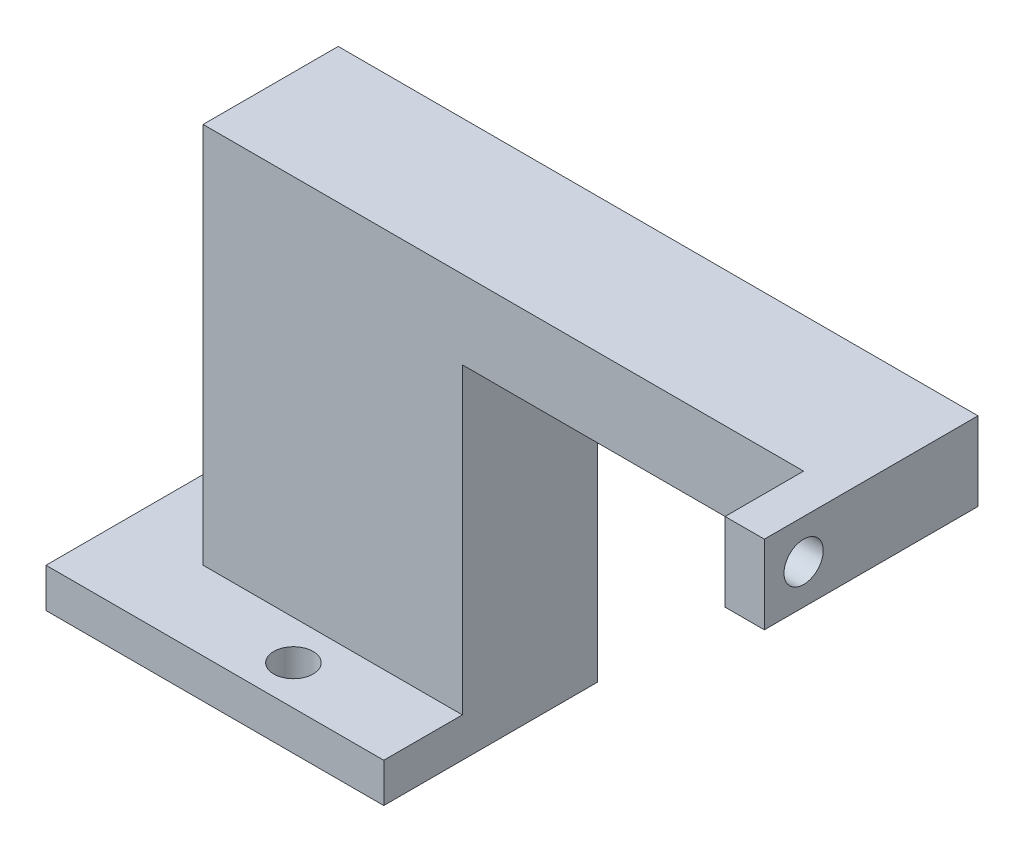
ISO-10303-21;
HEADER;
FILE_DESCRIPTION(('STEP AP214'),'2;1');
FILE_NAME('part.step','',(''),(''),'','','');
FILE_SCHEMA(('AUTOMOTIVE_DESIGN { 1 0 10303 214 1 1 1 1 }'));
ENDSEC;
DATA;
#1=APPLICATION_CONTEXT('core data for automotive mechanical design processes');
#2=APPLICATION_PROTOCOL_DEFINITION('international standard','automotive_design',2000,#1);
#3=PRODUCT_CONTEXT('',#1,'mechanical');
#4=PRODUCT('Part','Part','',(#3));
#5=PRODUCT_RELATED_PRODUCT_CATEGORY('part','',(#4));
#6=PRODUCT_DEFINITION_FORMATION('','',#4);
#7=PRODUCT_DEFINITION_CONTEXT('part definition',#1,'design');
#8=PRODUCT_DEFINITION('design','',#6,#7);
#9=PRODUCT_DEFINITION_SHAPE('','',#8);
#10=(LENGTH_UNIT() NAMED_UNIT(*) SI_UNIT(.MILLI.,.METRE.));
#11=(NAMED_UNIT(*) PLANE_ANGLE_UNIT() SI_UNIT($,.RADIAN.));
#12=(NAMED_UNIT(*) SI_UNIT($,.STERADIAN.) SOLID_ANGLE_UNIT());
#13=UNCERTAINTY_MEASURE_WITH_UNIT(LENGTH_MEASURE(1.E-05),#10,'distance_accuracy_value','');
#14=(GEOMETRIC_REPRESENTATION_CONTEXT(3) GLOBAL_UNCERTAINTY_ASSIGNED_CONTEXT((#13)) GLOBAL_UNIT_ASSIGNED_CONTEXT((#10,
#11,#12)) REPRESENTATION_CONTEXT('',''));
#15=CARTESIAN_POINT('',(0.,0.,0.));
#16=DIRECTION('',(0.,0.,1.));
#17=DIRECTION('',(1.,0.,0.));
#18=AXIS2_PLACEMENT_3D('',#15,#16,#17);
#19=CARTESIAN_POINT('',(-22.77,53.6,-7.8375));
#20=DIRECTION('',(1.,0.,0.));
#21=DIRECTION('',(0.,0.,-1.));
#22=AXIS2_PLACEMENT_3D('',#19,#20,#21);
#23=PLANE('',#22);
#24=DIRECTION('',(0.,0.,-1.));
#25=VECTOR('',#24,1.);
#26=CARTESIAN_POINT('',(-22.77,5.,19.3625));
#27=LINE('',#26,#25);
#28=CARTESIAN_POINT('',(-22.77,5.,9.3625));
#29=VERTEX_POINT('',#28);
#30=CARTESIAN_POINT('',(-22.77,5.,-7.8375));
#31=VERTEX_POINT('',#30);
#32=EDGE_CURVE('E11',#29,#31,#27,.T.);
#33=ORIENTED_EDGE('',*,*,#32,.F.);
#34=DIRECTION('',(0.,-1.,0.));
#35=VECTOR('',#34,1.);
#36=CARTESIAN_POINT('',(-22.77,53.6,9.3625));
#37=LINE('',#36,#35);
#38=CARTESIAN_POINT('',(-22.77,53.6,9.3625));
#39=VERTEX_POINT('',#38);
#40=EDGE_CURVE('E42',#39,#29,#37,.T.);
#41=ORIENTED_EDGE('',*,*,#40,.F.);
#42=DIRECTION('',(0.,0.,1.));
#43=VECTOR('',#42,1.);
#44=CARTESIAN_POINT('',(-22.77,53.6,-7.8375));
#45=LINE('',#44,#43);
#46=CARTESIAN_POINT('',(-22.77,53.6,-7.8375));
#47=VERTEX_POINT('',#46);
#48=EDGE_CURVE('E223',#47,#39,#45,.T.);
#49=ORIENTED_EDGE('',*,*,#48,.F.);
#50=DIRECTION('',(0.,-1.,0.));
#51=VECTOR('',#50,1.);
#52=CARTESIAN_POINT('',(-22.77,53.6,-7.8375));
#53=LINE('',#52,#51);
#54=EDGE_CURVE('E235',#47,#31,#53,.T.);
#55=ORIENTED_EDGE('',*,*,#54,.T.);
#56=EDGE_LOOP('',(#33,#41,#49,#55));
#57=FACE_BOUND('',#56,.T.);
#58=ADVANCED_FACE('F39',(#57),#23,.F.);
#59=CARTESIAN_POINT('',(-22.77,53.6,9.3625));
#60=DIRECTION('',(0.,0.,-1.));
#61=DIRECTION('',(-1.,0.,0.));
#62=AXIS2_PLACEMENT_3D('',#59,#60,#61);
#63=PLANE('',#62);
#64=DIRECTION('',(0.,-1.,0.));
#65=VECTOR('',#64,1.);
#66=CARTESIAN_POINT('',(53.68,53.6,9.3625));
#67=LINE('',#66,#65);
#68=CARTESIAN_POINT('',(53.68,53.6,9.3625));
#69=VERTEX_POINT('',#68);
#70=CARTESIAN_POINT('',(53.68,43.6,9.3625));
#71=VERTEX_POINT('',#70);
#72=EDGE_CURVE('E171',#69,#71,#67,.T.);
#73=ORIENTED_EDGE('',*,*,#72,.F.);
#74=DIRECTION('',(1.,0.,0.));
#75=VECTOR('',#74,1.);
#76=CARTESIAN_POINT('',(-22.77,53.6,9.3625));
#77=LINE('',#76,#75);
#78=EDGE_CURVE('E227',#39,#69,#77,.T.);
#79=ORIENTED_EDGE('',*,*,#78,.F.);
#80=ORIENTED_EDGE('',*,*,#40,.T.);
#81=DIRECTION('',(-1.,0.,0.));
#82=VECTOR('',#81,1.);
#83=CARTESIAN_POINT('',(-22.77,5.,9.3625));
#84=LINE('',#83,#82);
#85=CARTESIAN_POINT('',(10.23,5.,9.3625));
#86=VERTEX_POINT('',#85);
#87=EDGE_CURVE('E55',#86,#29,#84,.T.);
#88=ORIENTED_EDGE('',*,*,#87,.F.);
#89=DIRECTION('',(0.,-1.,0.));
#90=VECTOR('',#89,1.);
#91=CARTESIAN_POINT('',(10.23,53.6,9.3625));
#92=LINE('',#91,#90);
#93=CARTESIAN_POINT('',(10.23,43.6,9.3625));
#94=VERTEX_POINT('',#93);
#95=EDGE_CURVE('E245',#94,#86,#92,.T.);
#96=ORIENTED_EDGE('',*,*,#95,.F.);
#97=DIRECTION('',(-1.,0.,0.));
#98=VECTOR('',#97,1.);
#99=CARTESIAN_POINT('',(58.68,43.6,9.36249999999999));
#100=LINE('',#99,#98);
#101=EDGE_CURVE('E63',#71,#94,#100,.T.);
#102=ORIENTED_EDGE('',*,*,#101,.F.);
#103=EDGE_LOOP('',(#73,#79,#80,#88,#96,#102));
#104=FACE_BOUND('',#103,.T.);
#105=ADVANCED_FACE('F251',(#104),#63,.F.);
#106=CARTESIAN_POINT('',(10.23,53.6,-7.8375));
#107=DIRECTION('',(-1.,0.,0.));
#108=DIRECTION('',(0.,0.,1.));
#109=AXIS2_PLACEMENT_3D('',#106,#107,#108);
#110=PLANE('',#109);
#111=DIRECTION('',(0.,0.,-1.));
#112=VECTOR('',#111,1.);
#113=CARTESIAN_POINT('',(10.23,43.6,9.3625));
#114=LINE('',#113,#112);
#115=CARTESIAN_POINT('',(10.23,43.6,-7.8375));
#116=VERTEX_POINT('',#115);
#117=EDGE_CURVE('E203',#94,#116,#114,.T.);
#118=ORIENTED_EDGE('',*,*,#117,.F.);
#119=ORIENTED_EDGE('',*,*,#95,.T.);
#120=DIRECTION('',(0.,0.,-1.));
#121=VECTOR('',#120,1.);
#122=CARTESIAN_POINT('',(10.23,5.,19.3625));
#123=LINE('',#122,#121);
#124=CARTESIAN_POINT('',(10.23,5.,19.3625));
#125=VERTEX_POINT('',#124);
#126=EDGE_CURVE('E139',#125,#86,#123,.T.);
#127=ORIENTED_EDGE('',*,*,#126,.F.);
#128=DIRECTION('',(0.,1.,0.));
#129=VECTOR('',#128,1.);
#130=CARTESIAN_POINT('',(10.23,0.,19.3625));
#131=LINE('',#130,#129);
#132=CARTESIAN_POINT('',(10.23,0.,19.3625));
#133=VERTEX_POINT('',#132);
#134=EDGE_CURVE('E134',#133,#125,#131,.T.);
#135=ORIENTED_EDGE('',*,*,#134,.F.);
#136=DIRECTION('',(0.,0.,-1.));
#137=VECTOR('',#136,1.);
#138=CARTESIAN_POINT('',(10.23,0.,-7.8375));
#139=LINE('',#138,#137);
#140=CARTESIAN_POINT('',(10.23,0.,-7.8375));
#141=VERTEX_POINT('',#140);
#142=EDGE_CURVE('E222',#133,#141,#139,.T.);
#143=ORIENTED_EDGE('',*,*,#142,.T.);
#144=DIRECTION('',(0.,-1.,0.));
#145=VECTOR('',#144,1.);
#146=CARTESIAN_POINT('',(10.23,53.6,-7.8375));
#147=LINE('',#146,#145);
#148=EDGE_CURVE('E243',#116,#141,#147,.T.);
#149=ORIENTED_EDGE('',*,*,#148,.F.);
#150=EDGE_LOOP('',(#118,#119,#127,#135,#143,#149));
#151=FACE_BOUND('',#150,.T.);
#152=ADVANCED_FACE('F254',(#151),#110,.F.);
#153=CARTESIAN_POINT('',(-22.77,53.6,-7.8375));
#154=DIRECTION('',(0.,0.,1.));
#155=DIRECTION('',(1.,0.,0.));
#156=AXIS2_PLACEMENT_3D('',#153,#154,#155);
#157=PLANE('',#156);
#158=DIRECTION('',(-1.,0.,0.));
#159=VECTOR('',#158,1.);
#160=CARTESIAN_POINT('',(-22.77,0.,-7.8375));
#161=LINE('',#160,#159);
#162=CARTESIAN_POINT('',(-32.77,0.,-7.8375));
#163=VERTEX_POINT('',#162);
#164=EDGE_CURVE('E228',#141,#163,#161,.T.);
#165=ORIENTED_EDGE('',*,*,#164,.T.);
#166=DIRECTION('',(0.,-1.,0.));
#167=VECTOR('',#166,1.);
#168=CARTESIAN_POINT('',(-32.77,5.,-7.8375));
#169=LINE('',#168,#167);
#170=CARTESIAN_POINT('',(-32.77,5.,-7.8375));
#171=VERTEX_POINT('',#170);
#172=EDGE_CURVE('E150',#171,#163,#169,.T.);
#173=ORIENTED_EDGE('',*,*,#172,.F.);
#174=DIRECTION('',(1.,0.,0.));
#175=VECTOR('',#174,1.);
#176=CARTESIAN_POINT('',(-32.77,5.,-7.8375));
#177=LINE('',#176,#175);
#178=EDGE_CURVE('E145',#171,#31,#177,.T.);
#179=ORIENTED_EDGE('',*,*,#178,.T.);
#180=ORIENTED_EDGE('',*,*,#54,.F.);
#181=DIRECTION('',(-1.,0.,0.));
#182=VECTOR('',#181,1.);
#183=CARTESIAN_POINT('',(-22.77,53.6,-7.8375));
#184=LINE('',#183,#182);
#185=CARTESIAN_POINT('',(58.68,53.6,-7.83750000000001));
#186=VERTEX_POINT('',#185);
#187=EDGE_CURVE('E232',#186,#47,#184,.T.);
#188=ORIENTED_EDGE('',*,*,#187,.F.);
#189=DIRECTION('',(0.,1.,0.));
#190=VECTOR('',#189,1.);
#191=CARTESIAN_POINT('',(58.68,53.6,-7.83750000000001));
#192=LINE('',#191,#190);
#193=CARTESIAN_POINT('',(58.68,43.6,-7.83750000000001));
#194=VERTEX_POINT('',#193);
#195=EDGE_CURVE('E207',#194,#186,#192,.T.);
#196=ORIENTED_EDGE('',*,*,#195,.F.);
#197=DIRECTION('',(-1.,0.,0.));
#198=VECTOR('',#197,1.);
#199=CARTESIAN_POINT('',(58.68,43.6,-7.83750000000001));
#200=LINE('',#199,#198);
#201=EDGE_CURVE('E214',#194,#116,#200,.T.);
#202=ORIENTED_EDGE('',*,*,#201,.T.);
#203=ORIENTED_EDGE('',*,*,#148,.T.);
#204=EDGE_LOOP('',(#165,#173,#179,#180,#188,#196,#202,#203));
#205=FACE_BOUND('',#204,.T.);
#206=ADVANCED_FACE('F259',(#205),#157,.F.);
#207=CARTESIAN_POINT('',(0.,53.6,0.));
#208=DIRECTION('',(0.,1.,0.));
#209=DIRECTION('',(0.,0.,1.));
#210=AXIS2_PLACEMENT_3D('',#207,#208,#209);
#211=PLANE('',#210);
#212=ORIENTED_EDGE('',*,*,#48,.T.);
#213=ORIENTED_EDGE('',*,*,#78,.T.);
#214=DIRECTION('',(0.,0.,-1.));
#215=VECTOR('',#214,1.);
#216=CARTESIAN_POINT('',(53.68,53.6,19.3625));
#217=LINE('',#216,#215);
#218=CARTESIAN_POINT('',(53.68,53.6,19.3625));
#219=VERTEX_POINT('',#218);
#220=EDGE_CURVE('E191',#219,#69,#217,.T.);
#221=ORIENTED_EDGE('',*,*,#220,.F.);
#222=DIRECTION('',(-1.,0.,0.));
#223=VECTOR('',#222,1.);
#224=CARTESIAN_POINT('',(58.68,53.6,19.3625));
#225=LINE('',#224,#223);
#226=CARTESIAN_POINT('',(58.68,53.6,19.3625));
#227=VERTEX_POINT('',#226);
#228=EDGE_CURVE('E176',#227,#219,#225,.T.);
#229=ORIENTED_EDGE('',*,*,#228,.F.);
#230=DIRECTION('',(0.,0.,1.));
#231=VECTOR('',#230,1.);
#232=CARTESIAN_POINT('',(58.68,53.6,9.36249999999999));
#233=LINE('',#232,#231);
#234=EDGE_CURVE('E211',#186,#227,#233,.T.);
#235=ORIENTED_EDGE('',*,*,#234,.F.);
#236=ORIENTED_EDGE('',*,*,#187,.T.);
#237=EDGE_LOOP('',(#212,#213,#221,#229,#235,#236));
#238=FACE_BOUND('',#237,.T.);
#239=ADVANCED_FACE('F268',(#238),#211,.T.);
#240=CARTESIAN_POINT('',(0.,0.,0.));
#241=DIRECTION('',(0.,1.,0.));
#242=DIRECTION('',(0.,0.,1.));
#243=AXIS2_PLACEMENT_3D('',#240,#241,#242);
#244=PLANE('',#243);
#245=CARTESIAN_POINT('',(-27.77,0.,0.));
#246=DIRECTION('',(0.,1.,0.));
#247=DIRECTION('',(0.,0.,1.));
#248=AXIS2_PLACEMENT_3D('',#245,#246,#247);
#249=CIRCLE('',#248,2.5);
#250=CARTESIAN_POINT('',(-27.77,0.,2.5));
#251=VERTEX_POINT('',#250);
#252=EDGE_CURVE('E331',#251,#251,#249,.T.);
#253=ORIENTED_EDGE('',*,*,#252,.T.);
#254=EDGE_LOOP('',(#253));
#255=FACE_BOUND('',#254,.T.);
#256=CARTESIAN_POINT('',(-6.27000000000003,0.,14.3625));
#257=DIRECTION('',(0.,1.,0.));
#258=DIRECTION('',(0.,0.,1.));
#259=AXIS2_PLACEMENT_3D('',#256,#257,#258);
#260=CIRCLE('',#259,2.5);
#261=CARTESIAN_POINT('',(-6.27000000000003,0.,16.8625));
#262=VERTEX_POINT('',#261);
#263=EDGE_CURVE('E325',#262,#262,#260,.T.);
#264=ORIENTED_EDGE('',*,*,#263,.T.);
#265=EDGE_LOOP('',(#264));
#266=FACE_BOUND('',#265,.T.);
#267=DIRECTION('',(1.,0.,0.));
#268=VECTOR('',#267,1.);
#269=CARTESIAN_POINT('',(-22.77,0.,19.3625));
#270=LINE('',#269,#268);
#271=CARTESIAN_POINT('',(-32.77,0.,19.3625));
#272=VERTEX_POINT('',#271);
#273=EDGE_CURVE('E194',#272,#133,#270,.T.);
#274=ORIENTED_EDGE('',*,*,#273,.F.);
#275=DIRECTION('',(0.,0.,1.));
#276=VECTOR('',#275,1.);
#277=CARTESIAN_POINT('',(-32.77,0.,19.3625));
#278=LINE('',#277,#276);
#279=EDGE_CURVE('E155',#163,#272,#278,.T.);
#280=ORIENTED_EDGE('',*,*,#279,.F.);
#281=ORIENTED_EDGE('',*,*,#164,.F.);
#282=ORIENTED_EDGE('',*,*,#142,.F.);
#283=EDGE_LOOP('',(#274,#280,#281,#282));
#284=FACE_BOUND('',#283,.T.);
#285=ADVANCED_FACE('F257',(#255,#266,#284),#244,.F.);
#286=CARTESIAN_POINT('',(58.68,43.6,9.36249999999999));
#287=DIRECTION('',(0.,1.,0.));
#288=DIRECTION('',(0.,0.,1.));
#289=AXIS2_PLACEMENT_3D('',#286,#287,#288);
#290=PLANE('',#289);
#291=ORIENTED_EDGE('',*,*,#117,.T.);
#292=ORIENTED_EDGE('',*,*,#201,.F.);
#293=DIRECTION('',(0.,0.,-1.));
#294=VECTOR('',#293,1.);
#295=CARTESIAN_POINT('',(58.68,43.6,9.36249999999999));
#296=LINE('',#295,#294);
#297=CARTESIAN_POINT('',(58.68,43.6,19.3625));
#298=VERTEX_POINT('',#297);
#299=EDGE_CURVE('E204',#298,#194,#296,.T.);
#300=ORIENTED_EDGE('',*,*,#299,.F.);
#301=DIRECTION('',(1.,0.,0.));
#302=VECTOR('',#301,1.);
#303=CARTESIAN_POINT('',(58.68,43.6,19.3625));
#304=LINE('',#303,#302);
#305=CARTESIAN_POINT('',(53.68,43.6,19.3625));
#306=VERTEX_POINT('',#305);
#307=EDGE_CURVE('E182',#306,#298,#304,.T.);
#308=ORIENTED_EDGE('',*,*,#307,.F.);
#309=DIRECTION('',(0.,0.,-1.));
#310=VECTOR('',#309,1.);
#311=CARTESIAN_POINT('',(53.68,43.6,19.3625));
#312=LINE('',#311,#310);
#313=EDGE_CURVE('E186',#306,#71,#312,.T.);
#314=ORIENTED_EDGE('',*,*,#313,.T.);
#315=ORIENTED_EDGE('',*,*,#101,.T.);
#316=EDGE_LOOP('',(#291,#292,#300,#308,#314,#315));
#317=FACE_BOUND('',#316,.T.);
#318=ADVANCED_FACE('F262',(#317),#290,.F.);
#319=CARTESIAN_POINT('',(58.68,0.,0.));
#320=DIRECTION('',(1.,0.,0.));
#321=DIRECTION('',(0.,0.,-1.));
#322=AXIS2_PLACEMENT_3D('',#319,#320,#321);
#323=PLANE('',#322);
#324=CARTESIAN_POINT('',(58.68,48.6,14.3625));
#325=DIRECTION('',(1.,0.,0.));
#326=DIRECTION('',(0.,0.,-1.));
#327=AXIS2_PLACEMENT_3D('',#324,#325,#326);
#328=CIRCLE('',#327,2.5);
#329=CARTESIAN_POINT('',(58.68,48.6,11.8625));
#330=VERTEX_POINT('',#329);
#331=EDGE_CURVE('E157',#330,#330,#328,.T.);
#332=ORIENTED_EDGE('',*,*,#331,.F.);
#333=EDGE_LOOP('',(#332));
#334=FACE_BOUND('',#333,.T.);
#335=ORIENTED_EDGE('',*,*,#234,.T.);
#336=DIRECTION('',(0.,1.,0.));
#337=VECTOR('',#336,1.);
#338=CARTESIAN_POINT('',(58.68,53.6,19.3625));
#339=LINE('',#338,#337);
#340=EDGE_CURVE('E172',#298,#227,#339,.T.);
#341=ORIENTED_EDGE('',*,*,#340,.F.);
#342=ORIENTED_EDGE('',*,*,#299,.T.);
#343=ORIENTED_EDGE('',*,*,#195,.T.);
#344=EDGE_LOOP('',(#335,#341,#342,#343));
#345=FACE_BOUND('',#344,.T.);
#346=ADVANCED_FACE('F274',(#334,#345),#323,.T.);
#347=CARTESIAN_POINT('',(-22.77,5.,19.3625));
#348=DIRECTION('',(0.,-1.,0.));
#349=DIRECTION('',(1.,0.,0.));
#350=AXIS2_PLACEMENT_3D('',#347,#348,#349);
#351=PLANE('',#350);
#352=CARTESIAN_POINT('',(-27.77,5.,0.));
#353=DIRECTION('',(0.,1.,0.));
#354=DIRECTION('',(-1.,0.,0.));
#355=AXIS2_PLACEMENT_3D('',#352,#353,#354);
#356=CIRCLE('',#355,2.5);
#357=CARTESIAN_POINT('',(-30.27,5.,0.));
#358=VERTEX_POINT('',#357);
#359=EDGE_CURVE('E317',#358,#358,#356,.T.);
#360=ORIENTED_EDGE('',*,*,#359,.F.);
#361=EDGE_LOOP('',(#360));
#362=FACE_BOUND('',#361,.T.);
#363=CARTESIAN_POINT('',(-6.27000000000003,5.,14.3625));
#364=DIRECTION('',(0.,1.,0.));
#365=DIRECTION('',(-1.,0.,0.));
#366=AXIS2_PLACEMENT_3D('',#363,#364,#365);
#367=CIRCLE('',#366,2.5);
#368=CARTESIAN_POINT('',(-8.77000000000003,5.,14.3625));
#369=VERTEX_POINT('',#368);
#370=EDGE_CURVE('E320',#369,#369,#367,.T.);
#371=ORIENTED_EDGE('',*,*,#370,.F.);
#372=EDGE_LOOP('',(#371));
#373=FACE_BOUND('',#372,.T.);
#374=ORIENTED_EDGE('',*,*,#87,.T.);
#375=ORIENTED_EDGE('',*,*,#32,.T.);
#376=ORIENTED_EDGE('',*,*,#178,.F.);
#377=DIRECTION('',(0.,0.,-1.));
#378=VECTOR('',#377,1.);
#379=CARTESIAN_POINT('',(-32.77,5.,19.3625));
#380=LINE('',#379,#378);
#381=CARTESIAN_POINT('',(-32.77,5.,19.3625));
#382=VERTEX_POINT('',#381);
#383=EDGE_CURVE('E142',#382,#171,#380,.T.);
#384=ORIENTED_EDGE('',*,*,#383,.F.);
#385=DIRECTION('',(-1.,0.,0.));
#386=VECTOR('',#385,1.);
#387=CARTESIAN_POINT('',(-22.77,5.,19.3625));
#388=LINE('',#387,#386);
#389=EDGE_CURVE('E127',#125,#382,#388,.T.);
#390=ORIENTED_EDGE('',*,*,#389,.F.);
#391=ORIENTED_EDGE('',*,*,#126,.T.);
#392=EDGE_LOOP('',(#374,#375,#376,#384,#390,#391));
#393=FACE_BOUND('',#392,.T.);
#394=ADVANCED_FACE('F143',(#362,#373,#393),#351,.F.);
#395=CARTESIAN_POINT('',(0.,0.,19.3625));
#396=DIRECTION('',(0.,0.,-1.));
#397=DIRECTION('',(-1.,0.,0.));
#398=AXIS2_PLACEMENT_3D('',#395,#396,#397);
#399=PLANE('',#398);
#400=ORIENTED_EDGE('',*,*,#389,.T.);
#401=DIRECTION('',(0.,1.,0.));
#402=VECTOR('',#401,1.);
#403=CARTESIAN_POINT('',(-32.77,5.,19.3625));
#404=LINE('',#403,#402);
#405=EDGE_CURVE('E132',#272,#382,#404,.T.);
#406=ORIENTED_EDGE('',*,*,#405,.F.);
#407=ORIENTED_EDGE('',*,*,#273,.T.);
#408=ORIENTED_EDGE('',*,*,#134,.T.);
#409=EDGE_LOOP('',(#400,#406,#407,#408));
#410=FACE_BOUND('',#409,.T.);
#411=ADVANCED_FACE('F129',(#410),#399,.F.);
#412=CARTESIAN_POINT('',(53.68,53.6,19.3625));
#413=DIRECTION('',(1.,0.,0.));
#414=DIRECTION('',(0.,0.,-1.));
#415=AXIS2_PLACEMENT_3D('',#412,#413,#414);
#416=PLANE('',#415);
#417=CARTESIAN_POINT('',(53.68,48.6,14.3625));
#418=DIRECTION('',(-1.,0.,0.));
#419=DIRECTION('',(0.,0.,1.));
#420=AXIS2_PLACEMENT_3D('',#417,#418,#419);
#421=CIRCLE('',#420,2.5);
#422=CARTESIAN_POINT('',(53.68,48.6,16.8625));
#423=VERTEX_POINT('',#422);
#424=EDGE_CURVE('E161',#423,#423,#421,.T.);
#425=ORIENTED_EDGE('',*,*,#424,.F.);
#426=EDGE_LOOP('',(#425));
#427=FACE_BOUND('',#426,.T.);
#428=ORIENTED_EDGE('',*,*,#72,.T.);
#429=ORIENTED_EDGE('',*,*,#313,.F.);
#430=DIRECTION('',(0.,-1.,0.));
#431=VECTOR('',#430,1.);
#432=CARTESIAN_POINT('',(53.68,53.6,19.3625));
#433=LINE('',#432,#431);
#434=EDGE_CURVE('E179',#219,#306,#433,.T.);
#435=ORIENTED_EDGE('',*,*,#434,.F.);
#436=ORIENTED_EDGE('',*,*,#220,.T.);
#437=EDGE_LOOP('',(#428,#429,#435,#436));
#438=FACE_BOUND('',#437,.T.);
#439=ADVANCED_FACE('F278',(#427,#438),#416,.F.);
#440=CARTESIAN_POINT('',(0.,0.,19.3625));
#441=DIRECTION('',(0.,0.,-1.));
#442=DIRECTION('',(-1.,0.,0.));
#443=AXIS2_PLACEMENT_3D('',#440,#441,#442);
#444=PLANE('',#443);
#445=ORIENTED_EDGE('',*,*,#340,.T.);
#446=ORIENTED_EDGE('',*,*,#228,.T.);
#447=ORIENTED_EDGE('',*,*,#434,.T.);
#448=ORIENTED_EDGE('',*,*,#307,.T.);
#449=EDGE_LOOP('',(#445,#446,#447,#448));
#450=FACE_BOUND('',#449,.T.);
#451=ADVANCED_FACE('F277',(#450),#444,.F.);
#452=CARTESIAN_POINT('',(-32.77,0.,0.));
#453=DIRECTION('',(1.,0.,0.));
#454=DIRECTION('',(0.,0.,-1.));
#455=AXIS2_PLACEMENT_3D('',#452,#453,#454);
#456=PLANE('',#455);
#457=ORIENTED_EDGE('',*,*,#405,.T.);
#458=ORIENTED_EDGE('',*,*,#383,.T.);
#459=ORIENTED_EDGE('',*,*,#172,.T.);
#460=ORIENTED_EDGE('',*,*,#279,.T.);
#461=EDGE_LOOP('',(#457,#458,#459,#460));
#462=FACE_BOUND('',#461,.T.);
#463=ADVANCED_FACE('F153',(#462),#456,.F.);
#464=CARTESIAN_POINT('',(63.68,48.6,14.3625));
#465=DIRECTION('',(-1.,0.,0.));
#466=DIRECTION('',(0.,0.,1.));
#467=AXIS2_PLACEMENT_3D('',#464,#465,#466);
#468=CYLINDRICAL_SURFACE('',#467,2.5);
#469=ORIENTED_EDGE('',*,*,#331,.T.);
#470=EDGE_LOOP('',(#469));
#471=FACE_BOUND('',#470,.T.);
#472=ORIENTED_EDGE('',*,*,#424,.T.);
#473=EDGE_LOOP('',(#472));
#474=FACE_BOUND('',#473,.T.);
#475=ADVANCED_FACE('F337',(#471,#474),#468,.F.);
#476=CARTESIAN_POINT('',(-6.27000000000003,-5.,14.3625));
#477=DIRECTION('',(0.,1.,0.));
#478=DIRECTION('',(-1.,0.,0.));
#479=AXIS2_PLACEMENT_3D('',#476,#477,#478);
#480=CYLINDRICAL_SURFACE('',#479,2.5);
#481=ORIENTED_EDGE('',*,*,#370,.T.);
#482=EDGE_LOOP('',(#481));
#483=FACE_BOUND('',#482,.T.);
#484=ORIENTED_EDGE('',*,*,#263,.F.);
#485=EDGE_LOOP('',(#484));
#486=FACE_BOUND('',#485,.T.);
#487=ADVANCED_FACE('F339',(#483,#486),#480,.F.);
#488=CARTESIAN_POINT('',(-27.77,-5.,0.));
#489=DIRECTION('',(0.,1.,0.));
#490=DIRECTION('',(-1.,0.,0.));
#491=AXIS2_PLACEMENT_3D('',#488,#489,#490);
#492=CYLINDRICAL_SURFACE('',#491,2.5);
#493=ORIENTED_EDGE('',*,*,#359,.T.);
#494=EDGE_LOOP('',(#493));
#495=FACE_BOUND('',#494,.T.);
#496=ORIENTED_EDGE('',*,*,#252,.F.);
#497=EDGE_LOOP('',(#496));
#498=FACE_BOUND('',#497,.T.);
#499=ADVANCED_FACE('F346',(#495,#498),#492,.F.);
#500=CLOSED_SHELL('',(#58,#105,#152,#206,#239,#285,#318,#346,#394,#411,#439,#451,#463,#475,#487,#499));
#501=MANIFOLD_SOLID_BREP('B2',#500);
#502=ADVANCED_BREP_SHAPE_REPRESENTATION('',(#18,#501),#14);
#503=SHAPE_DEFINITION_REPRESENTATION(#9,#502);
ENDSEC;
END-ISO-10303-21;
